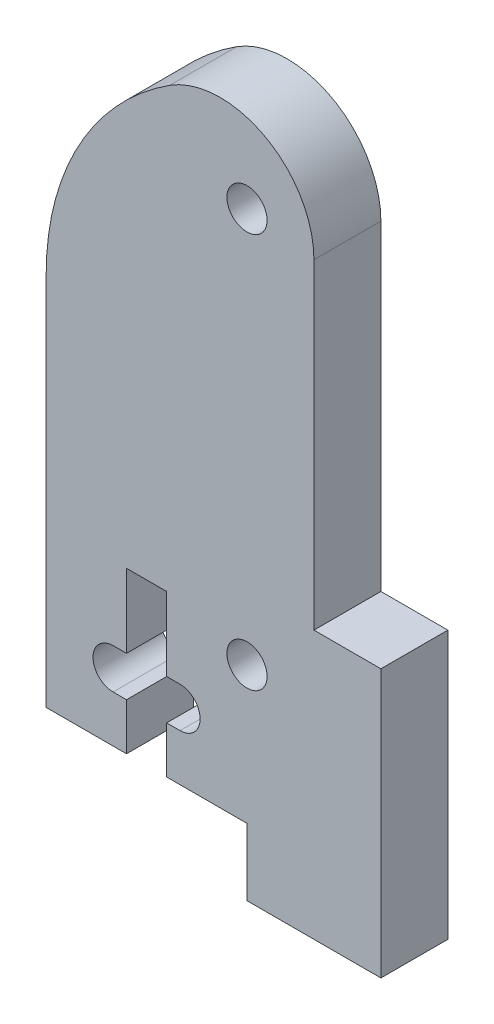
ISO-10303-21;
HEADER;
FILE_DESCRIPTION(('STEP AP214'),'2;1');
FILE_NAME('part.step','',(''),(''),'','','');
FILE_SCHEMA(('AUTOMOTIVE_DESIGN { 1 0 10303 214 1 1 1 1 }'));
ENDSEC;
DATA;
#1=APPLICATION_CONTEXT('core data for automotive mechanical design processes');
#2=APPLICATION_PROTOCOL_DEFINITION('international standard','automotive_design',2000,#1);
#3=PRODUCT_CONTEXT('',#1,'mechanical');
#4=PRODUCT('Part','Part','',(#3));
#5=PRODUCT_RELATED_PRODUCT_CATEGORY('part','',(#4));
#6=PRODUCT_DEFINITION_FORMATION('','',#4);
#7=PRODUCT_DEFINITION_CONTEXT('part definition',#1,'design');
#8=PRODUCT_DEFINITION('design','',#6,#7);
#9=PRODUCT_DEFINITION_SHAPE('','',#8);
#10=(LENGTH_UNIT() NAMED_UNIT(*) SI_UNIT(.MILLI.,.METRE.));
#11=(NAMED_UNIT(*) PLANE_ANGLE_UNIT() SI_UNIT($,.RADIAN.));
#12=(NAMED_UNIT(*) SI_UNIT($,.STERADIAN.) SOLID_ANGLE_UNIT());
#13=UNCERTAINTY_MEASURE_WITH_UNIT(LENGTH_MEASURE(1.E-05),#10,'distance_accuracy_value','');
#14=(GEOMETRIC_REPRESENTATION_CONTEXT(3) GLOBAL_UNCERTAINTY_ASSIGNED_CONTEXT((#13)) GLOBAL_UNIT_ASSIGNED_CONTEXT((#10,
#11,#12)) REPRESENTATION_CONTEXT('',''));
#15=CARTESIAN_POINT('',(0.,0.,0.));
#16=DIRECTION('',(0.,0.,1.));
#17=DIRECTION('',(1.,0.,0.));
#18=AXIS2_PLACEMENT_3D('',#15,#16,#17);
#19=CARTESIAN_POINT('',(1.10026145192228,-27.3593725153866,5.));
#20=DIRECTION('',(0.,-1.,0.));
#21=DIRECTION('',(0.,0.,-1.));
#22=AXIS2_PLACEMENT_3D('',#19,#20,#21);
#23=PLANE('',#22);
#24=DIRECTION('',(-1.,0.,0.));
#25=VECTOR('',#24,1.);
#26=CARTESIAN_POINT('',(1.10026145192228,-27.3593725153866,0.));
#27=LINE('',#26,#25);
#28=CARTESIAN_POINT('',(-5.39973854807773,-27.3593725153866,0.));
#29=VERTEX_POINT('',#28);
#30=CARTESIAN_POINT('',(-11.3997385480777,-27.3593725153866,0.));
#31=VERTEX_POINT('',#30);
#32=EDGE_CURVE('E298',#29,#31,#27,.T.);
#33=ORIENTED_EDGE('',*,*,#32,.F.);
#34=DIRECTION('',(0.,0.,1.));
#35=VECTOR('',#34,1.);
#36=CARTESIAN_POINT('',(-5.39973854807773,-27.3593725153866,-5.));
#37=LINE('',#36,#35);
#38=CARTESIAN_POINT('',(-5.39973854807773,-27.3593725153866,5.));
#39=VERTEX_POINT('',#38);
#40=EDGE_CURVE('E225',#29,#39,#37,.T.);
#41=ORIENTED_EDGE('',*,*,#40,.T.);
#42=DIRECTION('',(-1.,0.,0.));
#43=VECTOR('',#42,1.);
#44=CARTESIAN_POINT('',(1.10026145192228,-27.3593725153866,5.));
#45=LINE('',#44,#43);
#46=CARTESIAN_POINT('',(-11.3997385480777,-27.3593725153866,5.));
#47=VERTEX_POINT('',#46);
#48=EDGE_CURVE('E277',#39,#47,#45,.T.);
#49=ORIENTED_EDGE('',*,*,#48,.T.);
#50=DIRECTION('',(0.,0.,-1.));
#51=VECTOR('',#50,1.);
#52=CARTESIAN_POINT('',(-11.3997385480777,-27.3593725153866,5.));
#53=LINE('',#52,#51);
#54=EDGE_CURVE('E322',#47,#31,#53,.T.);
#55=ORIENTED_EDGE('',*,*,#54,.T.);
#56=EDGE_LOOP('',(#33,#41,#49,#55));
#57=FACE_BOUND('',#56,.T.);
#58=ADVANCED_FACE('F57',(#57),#23,.T.);
#59=CARTESIAN_POINT('',(8.60026145192228,-51.5811624528453,5.));
#60=DIRECTION('',(-1.,0.,0.));
#61=DIRECTION('',(0.,-1.,0.));
#62=AXIS2_PLACEMENT_3D('',#59,#60,#61);
#63=PLANE('',#62);
#64=DIRECTION('',(0.,1.,0.));
#65=VECTOR('',#64,1.);
#66=CARTESIAN_POINT('',(8.60026145192228,-51.5811624528453,0.));
#67=LINE('',#66,#65);
#68=CARTESIAN_POINT('',(8.60026145192227,-12.3593725153866,0.));
#69=VERTEX_POINT('',#68);
#70=CARTESIAN_POINT('',(8.60026145192227,11.5950786347168,0.));
#71=VERTEX_POINT('',#70);
#72=EDGE_CURVE('E268',#69,#71,#67,.T.);
#73=ORIENTED_EDGE('',*,*,#72,.T.);
#74=DIRECTION('',(0.,0.,-1.));
#75=VECTOR('',#74,1.);
#76=CARTESIAN_POINT('',(8.60026145192227,11.5950786347168,5.));
#77=LINE('',#76,#75);
#78=CARTESIAN_POINT('',(8.60026145192227,11.5950786347168,5.));
#79=VERTEX_POINT('',#78);
#80=EDGE_CURVE('E66',#71,#79,#77,.F.);
#81=ORIENTED_EDGE('',*,*,#80,.T.);
#82=DIRECTION('',(0.,1.,0.));
#83=VECTOR('',#82,1.);
#84=CARTESIAN_POINT('',(8.60026145192228,-51.5811624528453,5.));
#85=LINE('',#84,#83);
#86=CARTESIAN_POINT('',(8.60026145192227,-12.3593725153866,5.));
#87=VERTEX_POINT('',#86);
#88=EDGE_CURVE('E269',#87,#79,#85,.T.);
#89=ORIENTED_EDGE('',*,*,#88,.F.);
#90=DIRECTION('',(0.,0.,-1.));
#91=VECTOR('',#90,1.);
#92=CARTESIAN_POINT('',(8.60026145192227,-12.3593725153866,5.));
#93=LINE('',#92,#91);
#94=EDGE_CURVE('E291',#87,#69,#93,.T.);
#95=ORIENTED_EDGE('',*,*,#94,.T.);
#96=EDGE_LOOP('',(#73,#81,#89,#95));
#97=FACE_BOUND('',#96,.T.);
#98=ADVANCED_FACE('F394',(#97),#63,.F.);
#99=CARTESIAN_POINT('',(8.60026145192227,0.640627484613441,5.));
#100=DIRECTION('',(0.,0.,-1.));
#101=DIRECTION('',(-1.,0.,0.));
#102=AXIS2_PLACEMENT_3D('',#99,#100,#101);
#103=CYLINDRICAL_SURFACE('',#102,20.);
#104=CARTESIAN_POINT('',(8.60026145192227,0.640627484613441,5.));
#105=DIRECTION('',(0.,0.,1.));
#106=DIRECTION('',(1.,0.,0.));
#107=AXIS2_PLACEMENT_3D('',#104,#105,#106);
#108=CIRCLE('',#107,20.);
#109=CARTESIAN_POINT('',(-2.1689693173085,17.4936292540032,5.));
#110=VERTEX_POINT('',#109);
#111=CARTESIAN_POINT('',(-11.3997385480777,0.640627484613437,5.));
#112=VERTEX_POINT('',#111);
#113=EDGE_CURVE('E271',#110,#112,#108,.T.);
#114=ORIENTED_EDGE('',*,*,#113,.F.);
#115=DIRECTION('',(0.,0.,-1.));
#116=VECTOR('',#115,1.);
#117=CARTESIAN_POINT('',(-2.1689693173085,17.4936292540032,5.));
#118=LINE('',#117,#116);
#119=CARTESIAN_POINT('',(-2.1689693173085,17.4936292540032,0.));
#120=VERTEX_POINT('',#119);
#121=EDGE_CURVE('E355',#110,#120,#118,.T.);
#122=ORIENTED_EDGE('',*,*,#121,.T.);
#123=CARTESIAN_POINT('',(8.60026145192227,0.640627484613441,0.));
#124=DIRECTION('',(0.,0.,1.));
#125=DIRECTION('',(1.,0.,0.));
#126=AXIS2_PLACEMENT_3D('',#123,#124,#125);
#127=CIRCLE('',#126,20.);
#128=CARTESIAN_POINT('',(-11.3997385480777,0.640627484613437,0.));
#129=VERTEX_POINT('',#128);
#130=EDGE_CURVE('E293',#120,#129,#127,.T.);
#131=ORIENTED_EDGE('',*,*,#130,.T.);
#132=DIRECTION('',(0.,0.,-1.));
#133=VECTOR('',#132,1.);
#134=CARTESIAN_POINT('',(-11.3997385480777,0.640627484613437,5.));
#135=LINE('',#134,#133);
#136=EDGE_CURVE('E325',#112,#129,#135,.T.);
#137=ORIENTED_EDGE('',*,*,#136,.F.);
#138=EDGE_LOOP('',(#114,#122,#131,#137));
#139=FACE_BOUND('',#138,.T.);
#140=ADVANCED_FACE('F401',(#139),#103,.T.);
#141=CARTESIAN_POINT('',(-11.3997385480777,-51.5811624528453,5.));
#142=DIRECTION('',(-1.,0.,0.));
#143=DIRECTION('',(0.,0.,1.));
#144=AXIS2_PLACEMENT_3D('',#141,#142,#143);
#145=PLANE('',#144);
#146=DIRECTION('',(0.,1.,0.));
#147=VECTOR('',#146,1.);
#148=CARTESIAN_POINT('',(-11.3997385480777,-51.5811624528453,0.));
#149=LINE('',#148,#147);
#150=EDGE_CURVE('E295',#31,#129,#149,.T.);
#151=ORIENTED_EDGE('',*,*,#150,.F.);
#152=ORIENTED_EDGE('',*,*,#54,.F.);
#153=DIRECTION('',(0.,1.,0.));
#154=VECTOR('',#153,1.);
#155=CARTESIAN_POINT('',(-11.3997385480777,-51.5811624528453,5.));
#156=LINE('',#155,#154);
#157=EDGE_CURVE('E274',#47,#112,#156,.T.);
#158=ORIENTED_EDGE('',*,*,#157,.T.);
#159=ORIENTED_EDGE('',*,*,#136,.T.);
#160=EDGE_LOOP('',(#151,#152,#158,#159));
#161=FACE_BOUND('',#160,.T.);
#162=ADVANCED_FACE('F407',(#161),#145,.T.);
#163=DIRECTION('',(0.,0.,1.));
#164=VECTOR('',#163,1.);
#165=CARTESIAN_POINT('',(-2.39973854807772,-27.3593725153866,-5.));
#166=LINE('',#165,#164);
#167=CARTESIAN_POINT('',(-2.39973854807772,-27.3593725153866,0.));
#168=VERTEX_POINT('',#167);
#169=CARTESIAN_POINT('',(-2.39973854807772,-27.3593725153866,5.));
#170=VERTEX_POINT('',#169);
#171=EDGE_CURVE('E253',#168,#170,#166,.T.);
#172=ORIENTED_EDGE('',*,*,#171,.F.);
#173=CARTESIAN_POINT('',(3.60026145192227,-27.3593725153866,0.));
#174=VERTEX_POINT('',#173);
#175=EDGE_CURVE('E299',#174,#168,#27,.T.);
#176=ORIENTED_EDGE('',*,*,#175,.F.);
#177=DIRECTION('',(0.,0.,-1.));
#178=VECTOR('',#177,1.);
#179=CARTESIAN_POINT('',(3.60026145192227,-27.3593725153866,5.));
#180=LINE('',#179,#178);
#181=CARTESIAN_POINT('',(3.60026145192227,-27.3593725153866,5.));
#182=VERTEX_POINT('',#181);
#183=EDGE_CURVE('E320',#182,#174,#180,.T.);
#184=ORIENTED_EDGE('',*,*,#183,.F.);
#185=EDGE_CURVE('E278',#182,#170,#45,.T.);
#186=ORIENTED_EDGE('',*,*,#185,.T.);
#187=EDGE_LOOP('',(#172,#176,#184,#186));
#188=FACE_BOUND('',#187,.T.);
#189=ADVANCED_FACE('F397',(#188),#23,.T.);
#190=CARTESIAN_POINT('',(3.60026145192228,-51.5811624528453,5.));
#191=DIRECTION('',(1.,0.,0.));
#192=DIRECTION('',(0.,1.,0.));
#193=AXIS2_PLACEMENT_3D('',#190,#191,#192);
#194=PLANE('',#193);
#195=DIRECTION('',(0.,-1.,0.));
#196=VECTOR('',#195,1.);
#197=CARTESIAN_POINT('',(3.60026145192228,-51.5811624528453,0.));
#198=LINE('',#197,#196);
#199=CARTESIAN_POINT('',(3.60026145192228,-32.3593725153866,0.));
#200=VERTEX_POINT('',#199);
#201=EDGE_CURVE('E302',#174,#200,#198,.T.);
#202=ORIENTED_EDGE('',*,*,#201,.T.);
#203=DIRECTION('',(0.,0.,-1.));
#204=VECTOR('',#203,1.);
#205=CARTESIAN_POINT('',(3.60026145192228,-32.3593725153866,5.));
#206=LINE('',#205,#204);
#207=CARTESIAN_POINT('',(3.60026145192228,-32.3593725153866,5.));
#208=VERTEX_POINT('',#207);
#209=EDGE_CURVE('E318',#208,#200,#206,.T.);
#210=ORIENTED_EDGE('',*,*,#209,.F.);
#211=DIRECTION('',(0.,-1.,0.));
#212=VECTOR('',#211,1.);
#213=CARTESIAN_POINT('',(3.60026145192228,-51.5811624528453,5.));
#214=LINE('',#213,#212);
#215=EDGE_CURVE('E281',#182,#208,#214,.T.);
#216=ORIENTED_EDGE('',*,*,#215,.F.);
#217=ORIENTED_EDGE('',*,*,#183,.T.);
#218=EDGE_LOOP('',(#202,#210,#216,#217));
#219=FACE_BOUND('',#218,.T.);
#220=ADVANCED_FACE('F406',(#219),#194,.F.);
#221=CARTESIAN_POINT('',(1.10026145192228,-32.3593725153866,5.));
#222=DIRECTION('',(0.,-1.,0.));
#223=DIRECTION('',(0.,0.,-1.));
#224=AXIS2_PLACEMENT_3D('',#221,#222,#223);
#225=PLANE('',#224);
#226=DIRECTION('',(-1.,0.,0.));
#227=VECTOR('',#226,1.);
#228=CARTESIAN_POINT('',(1.10026145192228,-32.3593725153866,0.));
#229=LINE('',#228,#227);
#230=CARTESIAN_POINT('',(13.6002614519223,-32.3593725153866,0.));
#231=VERTEX_POINT('',#230);
#232=EDGE_CURVE('E305',#231,#200,#229,.T.);
#233=ORIENTED_EDGE('',*,*,#232,.F.);
#234=DIRECTION('',(0.,0.,-1.));
#235=VECTOR('',#234,1.);
#236=CARTESIAN_POINT('',(13.6002614519223,-32.3593725153866,5.));
#237=LINE('',#236,#235);
#238=CARTESIAN_POINT('',(13.6002614519223,-32.3593725153866,5.));
#239=VERTEX_POINT('',#238);
#240=EDGE_CURVE('E316',#239,#231,#237,.T.);
#241=ORIENTED_EDGE('',*,*,#240,.F.);
#242=DIRECTION('',(-1.,0.,0.));
#243=VECTOR('',#242,1.);
#244=CARTESIAN_POINT('',(1.10026145192228,-32.3593725153866,5.));
#245=LINE('',#244,#243);
#246=EDGE_CURVE('E283',#239,#208,#245,.T.);
#247=ORIENTED_EDGE('',*,*,#246,.T.);
#248=ORIENTED_EDGE('',*,*,#209,.T.);
#249=EDGE_LOOP('',(#233,#241,#247,#248));
#250=FACE_BOUND('',#249,.T.);
#251=ADVANCED_FACE('F413',(#250),#225,.T.);
#252=CARTESIAN_POINT('',(13.6002614519223,-51.5811624528453,5.));
#253=DIRECTION('',(-1.,0.,0.));
#254=DIRECTION('',(0.,0.,1.));
#255=AXIS2_PLACEMENT_3D('',#252,#253,#254);
#256=PLANE('',#255);
#257=DIRECTION('',(0.,1.,0.));
#258=VECTOR('',#257,1.);
#259=CARTESIAN_POINT('',(13.6002614519223,-51.5811624528453,0.));
#260=LINE('',#259,#258);
#261=CARTESIAN_POINT('',(13.6002614519223,-12.3593725153866,0.));
#262=VERTEX_POINT('',#261);
#263=EDGE_CURVE('E308',#231,#262,#260,.T.);
#264=ORIENTED_EDGE('',*,*,#263,.T.);
#265=DIRECTION('',(0.,0.,-1.));
#266=VECTOR('',#265,1.);
#267=CARTESIAN_POINT('',(13.6002614519223,-12.3593725153866,5.));
#268=LINE('',#267,#266);
#269=CARTESIAN_POINT('',(13.6002614519223,-12.3593725153866,5.));
#270=VERTEX_POINT('',#269);
#271=EDGE_CURVE('E314',#270,#262,#268,.T.);
#272=ORIENTED_EDGE('',*,*,#271,.F.);
#273=DIRECTION('',(0.,1.,0.));
#274=VECTOR('',#273,1.);
#275=CARTESIAN_POINT('',(13.6002614519223,-51.5811624528453,5.));
#276=LINE('',#275,#274);
#277=EDGE_CURVE('E286',#239,#270,#276,.T.);
#278=ORIENTED_EDGE('',*,*,#277,.F.);
#279=ORIENTED_EDGE('',*,*,#240,.T.);
#280=EDGE_LOOP('',(#264,#272,#278,#279));
#281=FACE_BOUND('',#280,.T.);
#282=ADVANCED_FACE('F389',(#281),#256,.F.);
#283=CARTESIAN_POINT('',(1.10026145192228,-12.3593725153866,5.));
#284=DIRECTION('',(0.,1.,0.));
#285=DIRECTION('',(0.,0.,1.));
#286=AXIS2_PLACEMENT_3D('',#283,#284,#285);
#287=PLANE('',#286);
#288=DIRECTION('',(1.,0.,0.));
#289=VECTOR('',#288,1.);
#290=CARTESIAN_POINT('',(1.10026145192228,-12.3593725153866,0.));
#291=LINE('',#290,#289);
#292=EDGE_CURVE('E272',#69,#262,#291,.T.);
#293=ORIENTED_EDGE('',*,*,#292,.F.);
#294=ORIENTED_EDGE('',*,*,#94,.F.);
#295=DIRECTION('',(1.,0.,0.));
#296=VECTOR('',#295,1.);
#297=CARTESIAN_POINT('',(1.10026145192228,-12.3593725153866,5.));
#298=LINE('',#297,#296);
#299=EDGE_CURVE('E288',#87,#270,#298,.T.);
#300=ORIENTED_EDGE('',*,*,#299,.T.);
#301=ORIENTED_EDGE('',*,*,#271,.T.);
#302=EDGE_LOOP('',(#293,#294,#300,#301));
#303=FACE_BOUND('',#302,.T.);
#304=ADVANCED_FACE('F380',(#303),#287,.T.);
#305=CARTESIAN_POINT('',(1.10026145192228,-51.5811624528453,5.));
#306=DIRECTION('',(0.,0.,1.));
#307=DIRECTION('',(1.,0.,0.));
#308=AXIS2_PLACEMENT_3D('',#305,#306,#307);
#309=PLANE('',#308);
#310=CARTESIAN_POINT('',(3.60026145192228,12.3906274846134,5.));
#311=DIRECTION('',(0.,0.,1.));
#312=DIRECTION('',(1.,0.,0.));
#313=AXIS2_PLACEMENT_3D('',#310,#311,#312);
#314=CIRCLE('',#313,1.5);
#315=CARTESIAN_POINT('',(5.10026145192228,12.3906274846134,5.));
#316=VERTEX_POINT('',#315);
#317=EDGE_CURVE('E369',#316,#316,#314,.T.);
#318=ORIENTED_EDGE('',*,*,#317,.F.);
#319=EDGE_LOOP('',(#318));
#320=FACE_BOUND('',#319,.T.);
#321=CARTESIAN_POINT('',(3.60026145192228,-17.1093725153865,5.));
#322=DIRECTION('',(0.,0.,1.));
#323=DIRECTION('',(1.,0.,0.));
#324=AXIS2_PLACEMENT_3D('',#321,#322,#323);
#325=CIRCLE('',#324,1.5);
#326=CARTESIAN_POINT('',(5.10026145192228,-17.1093725153865,5.));
#327=VERTEX_POINT('',#326);
#328=EDGE_CURVE('E361',#327,#327,#325,.T.);
#329=ORIENTED_EDGE('',*,*,#328,.F.);
#330=EDGE_LOOP('',(#329));
#331=FACE_BOUND('',#330,.T.);
#332=ORIENTED_EDGE('',*,*,#88,.T.);
#333=CARTESIAN_POINT('',(1.60026145192227,11.5950786347168,5.));
#334=DIRECTION('',(0.,0.,1.));
#335=DIRECTION('',(1.,0.,0.));
#336=AXIS2_PLACEMENT_3D('',#333,#334,#335);
#337=CIRCLE('',#336,7.);
#338=EDGE_CURVE('E12',#79,#110,#337,.T.);
#339=ORIENTED_EDGE('',*,*,#338,.T.);
#340=ORIENTED_EDGE('',*,*,#113,.T.);
#341=ORIENTED_EDGE('',*,*,#157,.F.);
#342=ORIENTED_EDGE('',*,*,#48,.F.);
#343=DIRECTION('',(0.,1.,0.));
#344=VECTOR('',#343,1.);
#345=CARTESIAN_POINT('',(-5.39973854807773,-27.3593725153866,5.));
#346=LINE('',#345,#344);
#347=CARTESIAN_POINT('',(-5.39973854807773,-23.8593725153866,5.));
#348=VERTEX_POINT('',#347);
#349=EDGE_CURVE('E229',#39,#348,#346,.T.);
#350=ORIENTED_EDGE('',*,*,#349,.T.);
#351=DIRECTION('',(1.,0.,0.));
#352=VECTOR('',#351,1.);
#353=CARTESIAN_POINT('',(-6.39973854807773,-23.8593725153866,5.));
#354=LINE('',#353,#352);
#355=CARTESIAN_POINT('',(-6.39973854807773,-23.8593725153866,5.));
#356=VERTEX_POINT('',#355);
#357=EDGE_CURVE('E207',#356,#348,#354,.T.);
#358=ORIENTED_EDGE('',*,*,#357,.F.);
#359=CARTESIAN_POINT('',(-6.39973854807773,-22.3593725153866,5.));
#360=DIRECTION('',(0.,0.,1.));
#361=DIRECTION('',(1.,0.,0.));
#362=AXIS2_PLACEMENT_3D('',#359,#360,#361);
#363=CIRCLE('',#362,1.5);
#364=CARTESIAN_POINT('',(-6.39973854807773,-20.8593725153866,5.));
#365=VERTEX_POINT('',#364);
#366=EDGE_CURVE('E217',#365,#356,#363,.T.);
#367=ORIENTED_EDGE('',*,*,#366,.F.);
#368=DIRECTION('',(1.,0.,0.));
#369=VECTOR('',#368,1.);
#370=CARTESIAN_POINT('',(-6.39973854807773,-20.8593725153866,5.));
#371=LINE('',#370,#369);
#372=CARTESIAN_POINT('',(-5.39973854807773,-20.8593725153866,5.));
#373=VERTEX_POINT('',#372);
#374=EDGE_CURVE('E214',#365,#373,#371,.T.);
#375=ORIENTED_EDGE('',*,*,#374,.T.);
#376=CARTESIAN_POINT('',(-5.39973854807773,-15.3593725153866,5.));
#377=VERTEX_POINT('',#376);
#378=EDGE_CURVE('E246',#373,#377,#346,.T.);
#379=ORIENTED_EDGE('',*,*,#378,.T.);
#380=DIRECTION('',(-1.,0.,0.));
#381=VECTOR('',#380,1.);
#382=CARTESIAN_POINT('',(-2.39973854807773,-15.3593725153866,5.));
#383=LINE('',#382,#381);
#384=CARTESIAN_POINT('',(-2.39973854807773,-15.3593725153866,5.));
#385=VERTEX_POINT('',#384);
#386=EDGE_CURVE('E245',#385,#377,#383,.T.);
#387=ORIENTED_EDGE('',*,*,#386,.F.);
#388=DIRECTION('',(0.,1.,0.));
#389=VECTOR('',#388,1.);
#390=CARTESIAN_POINT('',(-2.39973854807772,-27.3593725153866,5.));
#391=LINE('',#390,#389);
#392=CARTESIAN_POINT('',(-2.39973854807773,-20.8593725153866,5.));
#393=VERTEX_POINT('',#392);
#394=EDGE_CURVE('E249',#393,#385,#391,.T.);
#395=ORIENTED_EDGE('',*,*,#394,.F.);
#396=CARTESIAN_POINT('',(-1.39973854807773,-20.8593725153866,5.));
#397=VERTEX_POINT('',#396);
#398=EDGE_CURVE('E233',#393,#397,#371,.T.);
#399=ORIENTED_EDGE('',*,*,#398,.T.);
#400=CARTESIAN_POINT('',(-1.39973854807773,-22.3593725153866,5.));
#401=DIRECTION('',(0.,0.,1.));
#402=DIRECTION('',(1.,0.,0.));
#403=AXIS2_PLACEMENT_3D('',#400,#401,#402);
#404=CIRCLE('',#403,1.5);
#405=CARTESIAN_POINT('',(-1.39973854807773,-23.8593725153866,5.));
#406=VERTEX_POINT('',#405);
#407=EDGE_CURVE('E230',#406,#397,#404,.T.);
#408=ORIENTED_EDGE('',*,*,#407,.F.);
#409=CARTESIAN_POINT('',(-2.39973854807773,-23.8593725153866,5.));
#410=VERTEX_POINT('',#409);
#411=EDGE_CURVE('E224',#410,#406,#354,.T.);
#412=ORIENTED_EDGE('',*,*,#411,.F.);
#413=EDGE_CURVE('E250',#170,#410,#391,.T.);
#414=ORIENTED_EDGE('',*,*,#413,.F.);
#415=ORIENTED_EDGE('',*,*,#185,.F.);
#416=ORIENTED_EDGE('',*,*,#215,.T.);
#417=ORIENTED_EDGE('',*,*,#246,.F.);
#418=ORIENTED_EDGE('',*,*,#277,.T.);
#419=ORIENTED_EDGE('',*,*,#299,.F.);
#420=EDGE_LOOP('',(#332,#339,#340,#341,#342,#350,#358,#367,#375,#379,#387,#395,#399,#408,#412,
#414,#415,#416,#417,#418,#419));
#421=FACE_BOUND('',#420,.T.);
#422=ADVANCED_FACE('F227',(#320,#331,#421),#309,.T.);
#423=CARTESIAN_POINT('',(1.10026145192228,-51.5811624528453,0.));
#424=DIRECTION('',(0.,0.,1.));
#425=DIRECTION('',(1.,0.,0.));
#426=AXIS2_PLACEMENT_3D('',#423,#424,#425);
#427=PLANE('',#426);
#428=CARTESIAN_POINT('',(3.60026145192228,12.3906274846134,0.));
#429=DIRECTION('',(0.,0.,1.));
#430=DIRECTION('',(1.,0.,0.));
#431=AXIS2_PLACEMENT_3D('',#428,#429,#430);
#432=CIRCLE('',#431,1.5);
#433=CARTESIAN_POINT('',(5.10026145192228,12.3906274846134,0.));
#434=VERTEX_POINT('',#433);
#435=EDGE_CURVE('E61',#434,#434,#432,.T.);
#436=ORIENTED_EDGE('',*,*,#435,.T.);
#437=EDGE_LOOP('',(#436));
#438=FACE_BOUND('',#437,.T.);
#439=CARTESIAN_POINT('',(3.60026145192228,-17.1093725153865,0.));
#440=DIRECTION('',(0.,0.,1.));
#441=DIRECTION('',(1.,0.,0.));
#442=AXIS2_PLACEMENT_3D('',#439,#440,#441);
#443=CIRCLE('',#442,1.5);
#444=CARTESIAN_POINT('',(5.10026145192228,-17.1093725153865,0.));
#445=VERTEX_POINT('',#444);
#446=EDGE_CURVE('E359',#445,#445,#443,.T.);
#447=ORIENTED_EDGE('',*,*,#446,.T.);
#448=EDGE_LOOP('',(#447));
#449=FACE_BOUND('',#448,.T.);
#450=ORIENTED_EDGE('',*,*,#130,.F.);
#451=CARTESIAN_POINT('',(1.60026145192227,11.5950786347168,0.));
#452=DIRECTION('',(0.,0.,1.));
#453=DIRECTION('',(1.,0.,0.));
#454=AXIS2_PLACEMENT_3D('',#451,#452,#453);
#455=CIRCLE('',#454,7.);
#456=EDGE_CURVE('E81',#120,#71,#455,.F.);
#457=ORIENTED_EDGE('',*,*,#456,.T.);
#458=ORIENTED_EDGE('',*,*,#72,.F.);
#459=ORIENTED_EDGE('',*,*,#292,.T.);
#460=ORIENTED_EDGE('',*,*,#263,.F.);
#461=ORIENTED_EDGE('',*,*,#232,.T.);
#462=ORIENTED_EDGE('',*,*,#201,.F.);
#463=ORIENTED_EDGE('',*,*,#175,.T.);
#464=DIRECTION('',(0.,1.,0.));
#465=VECTOR('',#464,1.);
#466=CARTESIAN_POINT('',(-2.39973854807771,-51.5811624528453,0.));
#467=LINE('',#466,#465);
#468=CARTESIAN_POINT('',(-2.39973854807772,-23.8593725153866,0.));
#469=VERTEX_POINT('',#468);
#470=EDGE_CURVE('E352',#168,#469,#467,.T.);
#471=ORIENTED_EDGE('',*,*,#470,.T.);
#472=DIRECTION('',(1.,0.,0.));
#473=VECTOR('',#472,1.);
#474=CARTESIAN_POINT('',(1.10026145192228,-23.8593725153866,0.));
#475=LINE('',#474,#473);
#476=CARTESIAN_POINT('',(-1.39973854807773,-23.8593725153866,0.));
#477=VERTEX_POINT('',#476);
#478=EDGE_CURVE('E349',#469,#477,#475,.T.);
#479=ORIENTED_EDGE('',*,*,#478,.T.);
#480=CARTESIAN_POINT('',(-1.39973854807773,-22.3593725153866,0.));
#481=DIRECTION('',(0.,0.,1.));
#482=DIRECTION('',(1.,0.,0.));
#483=AXIS2_PLACEMENT_3D('',#480,#481,#482);
#484=CIRCLE('',#483,1.5);
#485=CARTESIAN_POINT('',(-1.39973854807773,-20.8593725153866,0.));
#486=VERTEX_POINT('',#485);
#487=EDGE_CURVE('E346',#477,#486,#484,.T.);
#488=ORIENTED_EDGE('',*,*,#487,.T.);
#489=DIRECTION('',(1.,0.,0.));
#490=VECTOR('',#489,1.);
#491=CARTESIAN_POINT('',(1.10026145192228,-20.8593725153866,0.));
#492=LINE('',#491,#490);
#493=CARTESIAN_POINT('',(-2.39973854807773,-20.8593725153866,0.));
#494=VERTEX_POINT('',#493);
#495=EDGE_CURVE('E342',#494,#486,#492,.T.);
#496=ORIENTED_EDGE('',*,*,#495,.F.);
#497=DIRECTION('',(0.,1.,0.));
#498=VECTOR('',#497,1.);
#499=CARTESIAN_POINT('',(-2.39973854807771,-51.5811624528453,0.));
#500=LINE('',#499,#498);
#501=CARTESIAN_POINT('',(-2.39973854807773,-15.3593725153866,0.));
#502=VERTEX_POINT('',#501);
#503=EDGE_CURVE('E338',#494,#502,#500,.T.);
#504=ORIENTED_EDGE('',*,*,#503,.T.);
#505=DIRECTION('',(-1.,0.,0.));
#506=VECTOR('',#505,1.);
#507=CARTESIAN_POINT('',(1.10026145192225,-15.3593725153866,0.));
#508=LINE('',#507,#506);
#509=CARTESIAN_POINT('',(-5.39973854807773,-15.3593725153866,0.));
#510=VERTEX_POINT('',#509);
#511=EDGE_CURVE('E330',#502,#510,#508,.T.);
#512=ORIENTED_EDGE('',*,*,#511,.T.);
#513=DIRECTION('',(0.,1.,0.));
#514=VECTOR('',#513,1.);
#515=CARTESIAN_POINT('',(-5.39973854807773,-51.5811624528453,0.));
#516=LINE('',#515,#514);
#517=CARTESIAN_POINT('',(-5.39973854807773,-20.8593725153866,0.));
#518=VERTEX_POINT('',#517);
#519=EDGE_CURVE('E328',#518,#510,#516,.T.);
#520=ORIENTED_EDGE('',*,*,#519,.F.);
#521=DIRECTION('',(1.,0.,0.));
#522=VECTOR('',#521,1.);
#523=CARTESIAN_POINT('',(1.10026145192228,-20.8593725153866,0.));
#524=LINE('',#523,#522);
#525=CARTESIAN_POINT('',(-6.39973854807773,-20.8593725153866,0.));
#526=VERTEX_POINT('',#525);
#527=EDGE_CURVE('E333',#526,#518,#524,.T.);
#528=ORIENTED_EDGE('',*,*,#527,.F.);
#529=CARTESIAN_POINT('',(-6.39973854807773,-22.3593725153866,0.));
#530=DIRECTION('',(0.,0.,1.));
#531=DIRECTION('',(1.,0.,0.));
#532=AXIS2_PLACEMENT_3D('',#529,#530,#531);
#533=CIRCLE('',#532,1.5);
#534=CARTESIAN_POINT('',(-6.39973854807773,-23.8593725153866,0.));
#535=VERTEX_POINT('',#534);
#536=EDGE_CURVE('E336',#526,#535,#533,.T.);
#537=ORIENTED_EDGE('',*,*,#536,.T.);
#538=DIRECTION('',(1.,0.,0.));
#539=VECTOR('',#538,1.);
#540=CARTESIAN_POINT('',(1.10026145192228,-23.8593725153866,0.));
#541=LINE('',#540,#539);
#542=CARTESIAN_POINT('',(-5.39973854807773,-23.8593725153866,0.));
#543=VERTEX_POINT('',#542);
#544=EDGE_CURVE('E210',#535,#543,#541,.T.);
#545=ORIENTED_EDGE('',*,*,#544,.T.);
#546=DIRECTION('',(0.,1.,0.));
#547=VECTOR('',#546,1.);
#548=CARTESIAN_POINT('',(-5.39973854807773,-51.5811624528453,0.));
#549=LINE('',#548,#547);
#550=EDGE_CURVE('E344',#29,#543,#549,.T.);
#551=ORIENTED_EDGE('',*,*,#550,.F.);
#552=ORIENTED_EDGE('',*,*,#32,.T.);
#553=ORIENTED_EDGE('',*,*,#150,.T.);
#554=EDGE_LOOP('',(#450,#457,#458,#459,#460,#461,#462,#463,#471,#479,#488,#496,#504,#512,#520,
#528,#537,#545,#551,#552,#553));
#555=FACE_BOUND('',#554,.T.);
#556=ADVANCED_FACE('F379',(#438,#449,#555),#427,.F.);
#557=CARTESIAN_POINT('',(-6.39973854807773,-20.8593725153866,-5.));
#558=DIRECTION('',(0.,-1.,0.));
#559=DIRECTION('',(0.,0.,-1.));
#560=AXIS2_PLACEMENT_3D('',#557,#558,#559);
#561=PLANE('',#560);
#562=ORIENTED_EDGE('',*,*,#495,.T.);
#563=DIRECTION('',(0.,0.,1.));
#564=VECTOR('',#563,1.);
#565=CARTESIAN_POINT('',(-1.39973854807773,-20.8593725153866,-5.));
#566=LINE('',#565,#564);
#567=EDGE_CURVE('E241',#486,#397,#566,.T.);
#568=ORIENTED_EDGE('',*,*,#567,.T.);
#569=ORIENTED_EDGE('',*,*,#398,.F.);
#570=DIRECTION('',(0.,0.,1.));
#571=VECTOR('',#570,1.);
#572=CARTESIAN_POINT('',(-2.39973854807773,-20.8593725153866,-5.));
#573=LINE('',#572,#571);
#574=EDGE_CURVE('E263',#494,#393,#573,.T.);
#575=ORIENTED_EDGE('',*,*,#574,.F.);
#576=EDGE_LOOP('',(#562,#568,#569,#575));
#577=FACE_BOUND('',#576,.T.);
#578=ADVANCED_FACE('F386',(#577),#561,.T.);
#579=CARTESIAN_POINT('',(-1.39973854807773,-22.3593725153866,-5.));
#580=DIRECTION('',(0.,0.,1.));
#581=DIRECTION('',(1.,0.,0.));
#582=AXIS2_PLACEMENT_3D('',#579,#580,#581);
#583=CYLINDRICAL_SURFACE('',#582,1.5);
#584=DIRECTION('',(0.,0.,1.));
#585=VECTOR('',#584,1.);
#586=CARTESIAN_POINT('',(-1.39973854807773,-23.8593725153866,-5.));
#587=LINE('',#586,#585);
#588=EDGE_CURVE('E213',#477,#406,#587,.T.);
#589=ORIENTED_EDGE('',*,*,#588,.T.);
#590=ORIENTED_EDGE('',*,*,#407,.T.);
#591=ORIENTED_EDGE('',*,*,#567,.F.);
#592=ORIENTED_EDGE('',*,*,#487,.F.);
#593=EDGE_LOOP('',(#589,#590,#591,#592));
#594=FACE_BOUND('',#593,.T.);
#595=ADVANCED_FACE('F437',(#594),#583,.F.);
#596=CARTESIAN_POINT('',(-6.39973854807773,-23.8593725153866,-5.));
#597=DIRECTION('',(0.,-1.,0.));
#598=DIRECTION('',(0.,0.,-1.));
#599=AXIS2_PLACEMENT_3D('',#596,#597,#598);
#600=PLANE('',#599);
#601=DIRECTION('',(0.,0.,1.));
#602=VECTOR('',#601,1.);
#603=CARTESIAN_POINT('',(-2.39973854807772,-23.8593725153866,-5.));
#604=LINE('',#603,#602);
#605=EDGE_CURVE('E240',#469,#410,#604,.T.);
#606=ORIENTED_EDGE('',*,*,#605,.T.);
#607=ORIENTED_EDGE('',*,*,#411,.T.);
#608=ORIENTED_EDGE('',*,*,#588,.F.);
#609=ORIENTED_EDGE('',*,*,#478,.F.);
#610=EDGE_LOOP('',(#606,#607,#608,#609));
#611=FACE_BOUND('',#610,.T.);
#612=ADVANCED_FACE('F432',(#611),#600,.F.);
#613=CARTESIAN_POINT('',(-6.39973854807773,-22.3593725153866,-5.));
#614=DIRECTION('',(0.,0.,1.));
#615=DIRECTION('',(1.,0.,0.));
#616=AXIS2_PLACEMENT_3D('',#613,#614,#615);
#617=CYLINDRICAL_SURFACE('',#616,1.5);
#618=DIRECTION('',(0.,0.,1.));
#619=VECTOR('',#618,1.);
#620=CARTESIAN_POINT('',(-6.39973854807773,-20.8593725153866,-5.));
#621=LINE('',#620,#619);
#622=EDGE_CURVE('E220',#526,#365,#621,.T.);
#623=ORIENTED_EDGE('',*,*,#622,.T.);
#624=ORIENTED_EDGE('',*,*,#366,.T.);
#625=DIRECTION('',(0.,0.,1.));
#626=VECTOR('',#625,1.);
#627=CARTESIAN_POINT('',(-6.39973854807773,-23.8593725153866,-5.));
#628=LINE('',#627,#626);
#629=EDGE_CURVE('E202',#535,#356,#628,.T.);
#630=ORIENTED_EDGE('',*,*,#629,.F.);
#631=ORIENTED_EDGE('',*,*,#536,.F.);
#632=EDGE_LOOP('',(#623,#624,#630,#631));
#633=FACE_BOUND('',#632,.T.);
#634=ADVANCED_FACE('F218',(#633),#617,.F.);
#635=ORIENTED_EDGE('',*,*,#527,.T.);
#636=DIRECTION('',(0.,0.,1.));
#637=VECTOR('',#636,1.);
#638=CARTESIAN_POINT('',(-5.39973854807773,-20.8593725153866,-5.));
#639=LINE('',#638,#637);
#640=EDGE_CURVE('E265',#518,#373,#639,.T.);
#641=ORIENTED_EDGE('',*,*,#640,.T.);
#642=ORIENTED_EDGE('',*,*,#374,.F.);
#643=ORIENTED_EDGE('',*,*,#622,.F.);
#644=EDGE_LOOP('',(#635,#641,#642,#643));
#645=FACE_BOUND('',#644,.T.);
#646=ADVANCED_FACE('F457',(#645),#561,.T.);
#647=ORIENTED_EDGE('',*,*,#629,.T.);
#648=ORIENTED_EDGE('',*,*,#357,.T.);
#649=DIRECTION('',(0.,0.,1.));
#650=VECTOR('',#649,1.);
#651=CARTESIAN_POINT('',(-5.39973854807773,-23.8593725153866,-5.));
#652=LINE('',#651,#650);
#653=EDGE_CURVE('E262',#543,#348,#652,.T.);
#654=ORIENTED_EDGE('',*,*,#653,.F.);
#655=ORIENTED_EDGE('',*,*,#544,.F.);
#656=EDGE_LOOP('',(#647,#648,#654,#655));
#657=FACE_BOUND('',#656,.T.);
#658=ADVANCED_FACE('F204',(#657),#600,.F.);
#659=CARTESIAN_POINT('',(-2.39973854807772,-27.3593725153866,-5.));
#660=DIRECTION('',(1.,0.,0.));
#661=DIRECTION('',(0.,1.,0.));
#662=AXIS2_PLACEMENT_3D('',#659,#660,#661);
#663=PLANE('',#662);
#664=ORIENTED_EDGE('',*,*,#171,.T.);
#665=ORIENTED_EDGE('',*,*,#413,.T.);
#666=ORIENTED_EDGE('',*,*,#605,.F.);
#667=ORIENTED_EDGE('',*,*,#470,.F.);
#668=EDGE_LOOP('',(#664,#665,#666,#667));
#669=FACE_BOUND('',#668,.T.);
#670=ADVANCED_FACE('F430',(#669),#663,.F.);
#671=CARTESIAN_POINT('',(-5.39973854807773,-27.3593725153866,-5.));
#672=DIRECTION('',(1.,0.,0.));
#673=DIRECTION('',(0.,1.,0.));
#674=AXIS2_PLACEMENT_3D('',#671,#672,#673);
#675=PLANE('',#674);
#676=ORIENTED_EDGE('',*,*,#550,.T.);
#677=ORIENTED_EDGE('',*,*,#653,.T.);
#678=ORIENTED_EDGE('',*,*,#349,.F.);
#679=ORIENTED_EDGE('',*,*,#40,.F.);
#680=EDGE_LOOP('',(#676,#677,#678,#679));
#681=FACE_BOUND('',#680,.T.);
#682=ADVANCED_FACE('F554',(#681),#675,.T.);
#683=CARTESIAN_POINT('',(-2.39973854807773,-15.3593725153866,-5.));
#684=DIRECTION('',(0.,1.,0.));
#685=DIRECTION('',(-1.,0.,0.));
#686=AXIS2_PLACEMENT_3D('',#683,#684,#685);
#687=PLANE('',#686);
#688=DIRECTION('',(0.,0.,1.));
#689=VECTOR('',#688,1.);
#690=CARTESIAN_POINT('',(-2.39973854807773,-15.3593725153866,-5.));
#691=LINE('',#690,#689);
#692=EDGE_CURVE('E255',#502,#385,#691,.T.);
#693=ORIENTED_EDGE('',*,*,#692,.T.);
#694=ORIENTED_EDGE('',*,*,#386,.T.);
#695=DIRECTION('',(0.,0.,1.));
#696=VECTOR('',#695,1.);
#697=CARTESIAN_POINT('',(-5.39973854807773,-15.3593725153866,-5.));
#698=LINE('',#697,#696);
#699=EDGE_CURVE('E257',#510,#377,#698,.T.);
#700=ORIENTED_EDGE('',*,*,#699,.F.);
#701=ORIENTED_EDGE('',*,*,#511,.F.);
#702=EDGE_LOOP('',(#693,#694,#700,#701));
#703=FACE_BOUND('',#702,.T.);
#704=ADVANCED_FACE('F452',(#703),#687,.F.);
#705=ORIENTED_EDGE('',*,*,#574,.T.);
#706=ORIENTED_EDGE('',*,*,#394,.T.);
#707=ORIENTED_EDGE('',*,*,#692,.F.);
#708=ORIENTED_EDGE('',*,*,#503,.F.);
#709=EDGE_LOOP('',(#705,#706,#707,#708));
#710=FACE_BOUND('',#709,.T.);
#711=ADVANCED_FACE('F445',(#710),#663,.F.);
#712=ORIENTED_EDGE('',*,*,#519,.T.);
#713=ORIENTED_EDGE('',*,*,#699,.T.);
#714=ORIENTED_EDGE('',*,*,#378,.F.);
#715=ORIENTED_EDGE('',*,*,#640,.F.);
#716=EDGE_LOOP('',(#712,#713,#714,#715));
#717=FACE_BOUND('',#716,.T.);
#718=ADVANCED_FACE('F455',(#717),#675,.T.);
#719=CARTESIAN_POINT('',(1.60026145192227,11.5950786347168,5.));
#720=DIRECTION('',(0.,0.,-1.));
#721=DIRECTION('',(-1.,0.,0.));
#722=AXIS2_PLACEMENT_3D('',#719,#720,#721);
#723=CYLINDRICAL_SURFACE('',#722,7.);
#724=ORIENTED_EDGE('',*,*,#338,.F.);
#725=ORIENTED_EDGE('',*,*,#80,.F.);
#726=ORIENTED_EDGE('',*,*,#456,.F.);
#727=ORIENTED_EDGE('',*,*,#121,.F.);
#728=EDGE_LOOP('',(#724,#725,#726,#727));
#729=FACE_BOUND('',#728,.T.);
#730=ADVANCED_FACE('F59',(#729),#723,.T.);
#731=CARTESIAN_POINT('',(3.60026145192228,-17.1093725153865,-5.));
#732=DIRECTION('',(0.,0.,1.));
#733=DIRECTION('',(1.,0.,0.));
#734=AXIS2_PLACEMENT_3D('',#731,#732,#733);
#735=CYLINDRICAL_SURFACE('',#734,1.5);
#736=ORIENTED_EDGE('',*,*,#328,.T.);
#737=EDGE_LOOP('',(#736));
#738=FACE_BOUND('',#737,.T.);
#739=ORIENTED_EDGE('',*,*,#446,.F.);
#740=EDGE_LOOP('',(#739));
#741=FACE_BOUND('',#740,.T.);
#742=ADVANCED_FACE('F606',(#738,#741),#735,.F.);
#743=CARTESIAN_POINT('',(3.60026145192228,12.3906274846134,-5.));
#744=DIRECTION('',(0.,0.,1.));
#745=DIRECTION('',(1.,0.,0.));
#746=AXIS2_PLACEMENT_3D('',#743,#744,#745);
#747=CYLINDRICAL_SURFACE('',#746,1.5);
#748=ORIENTED_EDGE('',*,*,#317,.T.);
#749=EDGE_LOOP('',(#748));
#750=FACE_BOUND('',#749,.T.);
#751=ORIENTED_EDGE('',*,*,#435,.F.);
#752=EDGE_LOOP('',(#751));
#753=FACE_BOUND('',#752,.T.);
#754=ADVANCED_FACE('F374',(#750,#753),#747,.F.);
#755=CLOSED_SHELL('',(#58,#98,#140,#162,#189,#220,#251,#282,#304,#422,#556,#578,#595,#612,#634,
#646,#658,#670,#682,#704,#711,#718,#730,#742,#754));
#756=MANIFOLD_SOLID_BREP('B2',#755);
#757=ADVANCED_BREP_SHAPE_REPRESENTATION('',(#18,#756),#14);
#758=SHAPE_DEFINITION_REPRESENTATION(#9,#757);
ENDSEC;
END-ISO-10303-21;
